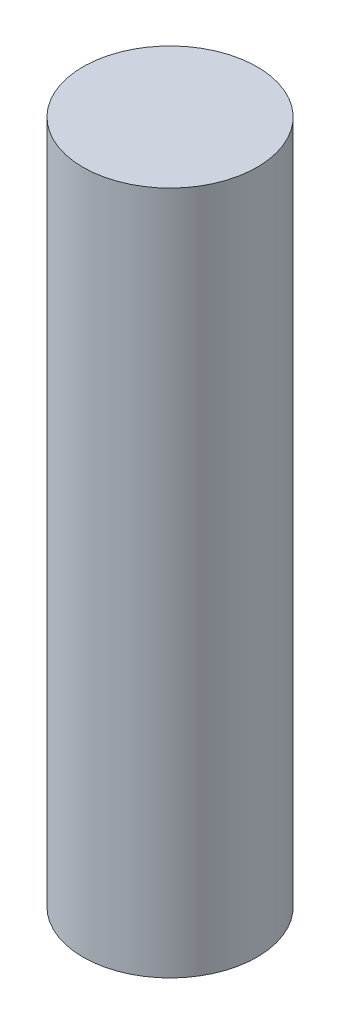
ISO-10303-21;
HEADER;
FILE_DESCRIPTION(('STEP AP214'),'2;1');
FILE_NAME('part.step','',(''),(''),'','','');
FILE_SCHEMA(('AUTOMOTIVE_DESIGN { 1 0 10303 214 1 1 1 1 }'));
ENDSEC;
DATA;
#1=APPLICATION_CONTEXT('core data for automotive mechanical design processes');
#2=APPLICATION_PROTOCOL_DEFINITION('international standard','automotive_design',2000,#1);
#3=PRODUCT_CONTEXT('',#1,'mechanical');
#4=PRODUCT('Part','Part','',(#3));
#5=PRODUCT_RELATED_PRODUCT_CATEGORY('part','',(#4));
#6=PRODUCT_DEFINITION_FORMATION('','',#4);
#7=PRODUCT_DEFINITION_CONTEXT('part definition',#1,'design');
#8=PRODUCT_DEFINITION('design','',#6,#7);
#9=PRODUCT_DEFINITION_SHAPE('','',#8);
#10=(LENGTH_UNIT() NAMED_UNIT(*) SI_UNIT(.MILLI.,.METRE.));
#11=(NAMED_UNIT(*) PLANE_ANGLE_UNIT() SI_UNIT($,.RADIAN.));
#12=(NAMED_UNIT(*) SI_UNIT($,.STERADIAN.) SOLID_ANGLE_UNIT());
#13=UNCERTAINTY_MEASURE_WITH_UNIT(LENGTH_MEASURE(1.E-05),#10,'distance_accuracy_value','');
#14=(GEOMETRIC_REPRESENTATION_CONTEXT(3) GLOBAL_UNCERTAINTY_ASSIGNED_CONTEXT((#13)) GLOBAL_UNIT_ASSIGNED_CONTEXT((#10,
#11,#12)) REPRESENTATION_CONTEXT('',''));
#15=CARTESIAN_POINT('',(0.,0.,0.));
#16=DIRECTION('',(0.,0.,1.));
#17=DIRECTION('',(1.,0.,0.));
#18=AXIS2_PLACEMENT_3D('',#15,#16,#17);
#19=CARTESIAN_POINT('',(0.,27.5,0.));
#20=DIRECTION('',(0.,-1.,0.));
#21=DIRECTION('',(0.,0.,-1.));
#22=AXIS2_PLACEMENT_3D('',#19,#20,#21);
#23=CYLINDRICAL_SURFACE('',#22,3.5);
#24=CARTESIAN_POINT('',(0.,27.5,0.));
#25=DIRECTION('',(0.,1.,0.));
#26=DIRECTION('',(0.,0.,1.));
#27=AXIS2_PLACEMENT_3D('',#24,#25,#26);
#28=CIRCLE('',#27,3.5);
#29=CARTESIAN_POINT('',(0.,27.5,3.5));
#30=VERTEX_POINT('',#29);
#31=EDGE_CURVE('E10',#30,#30,#28,.T.);
#32=ORIENTED_EDGE('',*,*,#31,.F.);
#33=EDGE_LOOP('',(#32));
#34=FACE_BOUND('',#33,.T.);
#35=CARTESIAN_POINT('',(0.,0.,0.));
#36=DIRECTION('',(0.,1.,0.));
#37=DIRECTION('',(0.,0.,1.));
#38=AXIS2_PLACEMENT_3D('',#35,#36,#37);
#39=CIRCLE('',#38,3.5);
#40=CARTESIAN_POINT('',(0.,0.,3.5));
#41=VERTEX_POINT('',#40);
#42=EDGE_CURVE('E46',#41,#41,#39,.T.);
#43=ORIENTED_EDGE('',*,*,#42,.T.);
#44=EDGE_LOOP('',(#43));
#45=FACE_BOUND('',#44,.T.);
#46=ADVANCED_FACE('F43',(#34,#45),#23,.T.);
#47=CARTESIAN_POINT('',(0.,27.5,0.));
#48=DIRECTION('',(0.,1.,0.));
#49=DIRECTION('',(0.,0.,1.));
#50=AXIS2_PLACEMENT_3D('',#47,#48,#49);
#51=PLANE('',#50);
#52=ORIENTED_EDGE('',*,*,#31,.T.);
#53=EDGE_LOOP('',(#52));
#54=FACE_BOUND('',#53,.T.);
#55=ADVANCED_FACE('F60',(#54),#51,.T.);
#56=CARTESIAN_POINT('',(0.,0.,0.));
#57=DIRECTION('',(0.,1.,0.));
#58=DIRECTION('',(0.,0.,1.));
#59=AXIS2_PLACEMENT_3D('',#56,#57,#58);
#60=PLANE('',#59);
#61=ORIENTED_EDGE('',*,*,#42,.F.);
#62=EDGE_LOOP('',(#61));
#63=FACE_BOUND('',#62,.T.);
#64=ADVANCED_FACE('F58',(#63),#60,.F.);
#65=CLOSED_SHELL('',(#46,#55,#64));
#66=MANIFOLD_SOLID_BREP('B2',#65);
#67=ADVANCED_BREP_SHAPE_REPRESENTATION('',(#18,#66),#14);
#68=SHAPE_DEFINITION_REPRESENTATION(#9,#67);
ENDSEC;
END-ISO-10303-21;
